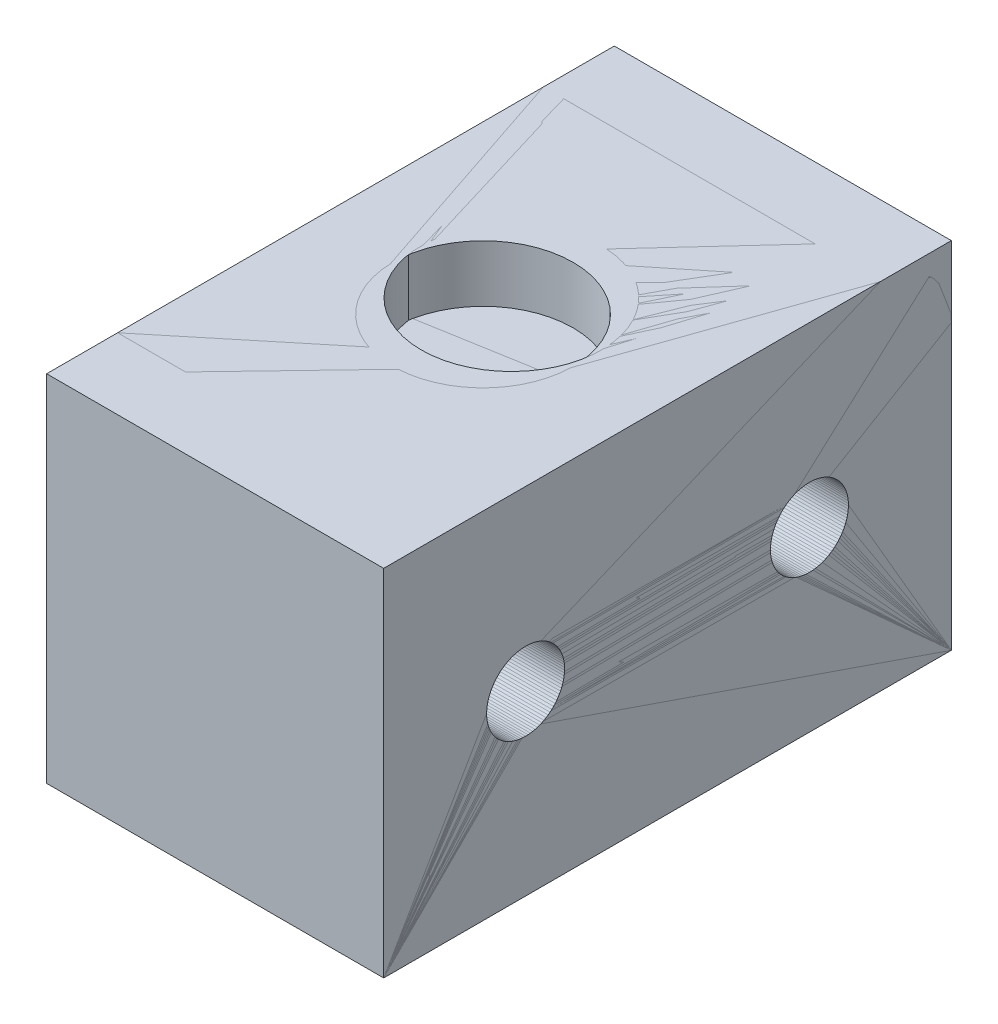
ISO-10303-21;
HEADER;
FILE_DESCRIPTION(('STEP AP214'),'2;1');
FILE_NAME('part.step','',(''),(''),'','','');
FILE_SCHEMA(('AUTOMOTIVE_DESIGN { 1 0 10303 214 1 1 1 1 }'));
ENDSEC;
DATA;
#1=APPLICATION_CONTEXT('core data for automotive mechanical design processes');
#2=APPLICATION_PROTOCOL_DEFINITION('international standard','automotive_design',2000,#1);
#3=PRODUCT_CONTEXT('',#1,'mechanical');
#4=PRODUCT('Part','Part','',(#3));
#5=PRODUCT_RELATED_PRODUCT_CATEGORY('part','',(#4));
#6=PRODUCT_DEFINITION_FORMATION('','',#4);
#7=PRODUCT_DEFINITION_CONTEXT('part definition',#1,'design');
#8=PRODUCT_DEFINITION('design','',#6,#7);
#9=PRODUCT_DEFINITION_SHAPE('','',#8);
#10=(LENGTH_UNIT() NAMED_UNIT(*) SI_UNIT(.MILLI.,.METRE.));
#11=(NAMED_UNIT(*) PLANE_ANGLE_UNIT() SI_UNIT($,.RADIAN.));
#12=(NAMED_UNIT(*) SI_UNIT($,.STERADIAN.) SOLID_ANGLE_UNIT());
#13=UNCERTAINTY_MEASURE_WITH_UNIT(LENGTH_MEASURE(1.E-05),#10,'distance_accuracy_value','');
#14=(GEOMETRIC_REPRESENTATION_CONTEXT(3) GLOBAL_UNCERTAINTY_ASSIGNED_CONTEXT((#13)) GLOBAL_UNIT_ASSIGNED_CONTEXT((#10,
#11,#12)) REPRESENTATION_CONTEXT('',''));
#15=CARTESIAN_POINT('',(0.,0.,0.));
#16=DIRECTION('',(0.,0.,1.));
#17=DIRECTION('',(1.,0.,0.));
#18=AXIS2_PLACEMENT_3D('',#15,#16,#17);
#19=CARTESIAN_POINT('',(-23.75,100.,0.));
#20=DIRECTION('',(-1.,0.,0.));
#21=DIRECTION('',(0.,0.,-1.));
#22=AXIS2_PLACEMENT_3D('',#19,#20,#21);
#23=PLANE('',#22);
#24=CARTESIAN_POINT('',(-23.7499999999999,87.5,-30.));
#25=DIRECTION('',(-1.,0.,0.));
#26=DIRECTION('',(0.,0.,1.));
#27=AXIS2_PLACEMENT_3D('',#24,#25,#26);
#28=CIRCLE('',#27,2.74999999999999);
#29=CARTESIAN_POINT('',(-23.7499999999999,87.5,-27.25));
#30=VERTEX_POINT('',#29);
#31=EDGE_CURVE('E182',#30,#30,#28,.T.);
#32=ORIENTED_EDGE('',*,*,#31,.F.);
#33=EDGE_LOOP('',(#32));
#34=FACE_BOUND('',#33,.T.);
#35=DIRECTION('',(0.,-1.,0.));
#36=VECTOR('',#35,1.);
#37=CARTESIAN_POINT('',(-23.75,100.,-40.));
#38=LINE('',#37,#36);
#39=CARTESIAN_POINT('',(-23.75,95.,-40.));
#40=VERTEX_POINT('',#39);
#41=CARTESIAN_POINT('',(-23.75,75.,-40.));
#42=VERTEX_POINT('',#41);
#43=EDGE_CURVE('E133',#40,#42,#38,.T.);
#44=ORIENTED_EDGE('',*,*,#43,.T.);
#45=DIRECTION('',(0.,0.,-1.));
#46=VECTOR('',#45,1.);
#47=CARTESIAN_POINT('',(-23.75,75.,0.));
#48=LINE('',#47,#46);
#49=CARTESIAN_POINT('',(-23.75,75.,0.));
#50=VERTEX_POINT('',#49);
#51=EDGE_CURVE('E113',#50,#42,#48,.T.);
#52=ORIENTED_EDGE('',*,*,#51,.F.);
#53=DIRECTION('',(0.,-1.,0.));
#54=VECTOR('',#53,1.);
#55=CARTESIAN_POINT('',(-23.75,100.,0.));
#56=LINE('',#55,#54);
#57=CARTESIAN_POINT('',(-23.75,100.,0.));
#58=VERTEX_POINT('',#57);
#59=EDGE_CURVE('E99',#58,#50,#56,.T.);
#60=ORIENTED_EDGE('',*,*,#59,.F.);
#61=DIRECTION('',(0.,0.,-1.));
#62=VECTOR('',#61,1.);
#63=CARTESIAN_POINT('',(-23.75,100.,0.));
#64=LINE('',#63,#62);
#65=CARTESIAN_POINT('',(-23.75,100.,-35.));
#66=VERTEX_POINT('',#65);
#67=EDGE_CURVE('E95',#58,#66,#64,.T.);
#68=ORIENTED_EDGE('',*,*,#67,.T.);
#69=CARTESIAN_POINT('',(-23.75,95.,-35.));
#70=DIRECTION('',(1.,0.,0.));
#71=DIRECTION('',(0.,0.,-1.));
#72=AXIS2_PLACEMENT_3D('',#69,#70,#71);
#73=CIRCLE('',#72,5.);
#74=EDGE_CURVE('E120',#40,#66,#73,.T.);
#75=ORIENTED_EDGE('',*,*,#74,.F.);
#76=EDGE_LOOP('',(#44,#52,#60,#68,#75));
#77=FACE_BOUND('',#76,.T.);
#78=CARTESIAN_POINT('',(-23.7499999999999,87.5,-10.));
#79=DIRECTION('',(-1.,0.,0.));
#80=DIRECTION('',(0.,0.,1.));
#81=AXIS2_PLACEMENT_3D('',#78,#79,#80);
#82=CIRCLE('',#81,2.74999999999999);
#83=CARTESIAN_POINT('',(-23.7499999999999,87.5,-7.25000000000001));
#84=VERTEX_POINT('',#83);
#85=EDGE_CURVE('E172',#84,#84,#82,.T.);
#86=ORIENTED_EDGE('',*,*,#85,.F.);
#87=EDGE_LOOP('',(#86));
#88=FACE_BOUND('',#87,.T.);
#89=ADVANCED_FACE('F47',(#34,#77,#88),#23,.T.);
#90=CARTESIAN_POINT('',(0.,100.,0.));
#91=DIRECTION('',(1.,0.,0.));
#92=DIRECTION('',(0.,1.,0.));
#93=AXIS2_PLACEMENT_3D('',#90,#91,#92);
#94=PLANE('',#93);
#95=CARTESIAN_POINT('',(0.,87.5,-30.));
#96=DIRECTION('',(-1.,0.,0.));
#97=DIRECTION('',(0.,0.,1.));
#98=AXIS2_PLACEMENT_3D('',#95,#96,#97);
#99=CIRCLE('',#98,2.74999999999999);
#100=CARTESIAN_POINT('',(0.,87.5,-27.25));
#101=VERTEX_POINT('',#100);
#102=EDGE_CURVE('E185',#101,#101,#99,.T.);
#103=ORIENTED_EDGE('',*,*,#102,.T.);
#104=EDGE_LOOP('',(#103));
#105=FACE_BOUND('',#104,.T.);
#106=CARTESIAN_POINT('',(0.,87.5,-10.));
#107=DIRECTION('',(-1.,0.,0.));
#108=DIRECTION('',(0.,0.,1.));
#109=AXIS2_PLACEMENT_3D('',#106,#107,#108);
#110=CIRCLE('',#109,2.74999999999999);
#111=CARTESIAN_POINT('',(0.,87.5,-7.25000000000001));
#112=VERTEX_POINT('',#111);
#113=EDGE_CURVE('E177',#112,#112,#110,.T.);
#114=ORIENTED_EDGE('',*,*,#113,.T.);
#115=EDGE_LOOP('',(#114));
#116=FACE_BOUND('',#115,.T.);
#117=DIRECTION('',(0.,0.,-1.));
#118=VECTOR('',#117,1.);
#119=CARTESIAN_POINT('',(0.,100.,0.));
#120=LINE('',#119,#118);
#121=CARTESIAN_POINT('',(0.,100.,0.));
#122=VERTEX_POINT('',#121);
#123=CARTESIAN_POINT('',(0.,100.,-35.));
#124=VERTEX_POINT('',#123);
#125=EDGE_CURVE('E93',#122,#124,#120,.T.);
#126=ORIENTED_EDGE('',*,*,#125,.F.);
#127=DIRECTION('',(0.,1.,0.));
#128=VECTOR('',#127,1.);
#129=CARTESIAN_POINT('',(0.,100.,0.));
#130=LINE('',#129,#128);
#131=CARTESIAN_POINT('',(0.,75.,0.));
#132=VERTEX_POINT('',#131);
#133=EDGE_CURVE('E100',#132,#122,#130,.T.);
#134=ORIENTED_EDGE('',*,*,#133,.F.);
#135=DIRECTION('',(0.,0.,-1.));
#136=VECTOR('',#135,1.);
#137=CARTESIAN_POINT('',(0.,75.,0.));
#138=LINE('',#137,#136);
#139=CARTESIAN_POINT('',(0.,75.,-40.));
#140=VERTEX_POINT('',#139);
#141=EDGE_CURVE('E121',#132,#140,#138,.T.);
#142=ORIENTED_EDGE('',*,*,#141,.T.);
#143=DIRECTION('',(0.,1.,0.));
#144=VECTOR('',#143,1.);
#145=CARTESIAN_POINT('',(0.,100.,-40.));
#146=LINE('',#145,#144);
#147=CARTESIAN_POINT('',(0.,95.,-40.));
#148=VERTEX_POINT('',#147);
#149=EDGE_CURVE('E131',#140,#148,#146,.T.);
#150=ORIENTED_EDGE('',*,*,#149,.T.);
#151=CARTESIAN_POINT('',(0.,95.,-35.));
#152=DIRECTION('',(-1.,0.,0.));
#153=DIRECTION('',(0.,1.,0.));
#154=AXIS2_PLACEMENT_3D('',#151,#152,#153);
#155=CIRCLE('',#154,5.);
#156=EDGE_CURVE('E12',#124,#148,#155,.T.);
#157=ORIENTED_EDGE('',*,*,#156,.F.);
#158=EDGE_LOOP('',(#126,#134,#142,#150,#157));
#159=FACE_BOUND('',#158,.T.);
#160=ADVANCED_FACE('F110',(#105,#116,#159),#94,.T.);
#161=CARTESIAN_POINT('',(0.,75.,0.));
#162=DIRECTION('',(0.,-1.,0.));
#163=DIRECTION('',(0.,0.,1.));
#164=AXIS2_PLACEMENT_3D('',#161,#162,#163);
#165=PLANE('',#164);
#166=DIRECTION('',(1.,0.,0.));
#167=VECTOR('',#166,1.);
#168=CARTESIAN_POINT('',(0.,75.,-40.));
#169=LINE('',#168,#167);
#170=EDGE_CURVE('E108',#42,#140,#169,.T.);
#171=ORIENTED_EDGE('',*,*,#170,.T.);
#172=ORIENTED_EDGE('',*,*,#141,.F.);
#173=DIRECTION('',(1.,0.,0.));
#174=VECTOR('',#173,1.);
#175=CARTESIAN_POINT('',(0.,75.,0.));
#176=LINE('',#175,#174);
#177=EDGE_CURVE('E104',#50,#132,#176,.T.);
#178=ORIENTED_EDGE('',*,*,#177,.F.);
#179=ORIENTED_EDGE('',*,*,#51,.T.);
#180=EDGE_LOOP('',(#171,#172,#178,#179));
#181=FACE_BOUND('',#180,.T.);
#182=ADVANCED_FACE('F138',(#181),#165,.T.);
#183=CARTESIAN_POINT('',(0.,100.,0.));
#184=DIRECTION('',(0.,1.,0.));
#185=DIRECTION('',(0.,0.,-1.));
#186=AXIS2_PLACEMENT_3D('',#183,#184,#185);
#187=PLANE('',#186);
#188=CARTESIAN_POINT('',(-12.,100.,-19.));
#189=DIRECTION('',(0.,-1.,0.));
#190=DIRECTION('',(0.,0.,-1.));
#191=AXIS2_PLACEMENT_3D('',#188,#189,#190);
#192=CIRCLE('',#191,6.35);
#193=CARTESIAN_POINT('',(-12.,100.,-25.35));
#194=VERTEX_POINT('',#193);
#195=EDGE_CURVE('E170',#194,#194,#192,.T.);
#196=ORIENTED_EDGE('',*,*,#195,.T.);
#197=EDGE_LOOP('',(#196));
#198=FACE_BOUND('',#197,.T.);
#199=ORIENTED_EDGE('',*,*,#67,.F.);
#200=DIRECTION('',(-1.,0.,0.));
#201=VECTOR('',#200,1.);
#202=CARTESIAN_POINT('',(0.,100.,0.));
#203=LINE('',#202,#201);
#204=EDGE_CURVE('E89',#122,#58,#203,.T.);
#205=ORIENTED_EDGE('',*,*,#204,.F.);
#206=ORIENTED_EDGE('',*,*,#125,.T.);
#207=DIRECTION('',(-1.,0.,0.));
#208=VECTOR('',#207,1.);
#209=CARTESIAN_POINT('',(0.,100.,-35.));
#210=LINE('',#209,#208);
#211=EDGE_CURVE('E55',#66,#124,#210,.F.);
#212=ORIENTED_EDGE('',*,*,#211,.F.);
#213=EDGE_LOOP('',(#199,#205,#206,#212));
#214=FACE_BOUND('',#213,.T.);
#215=ADVANCED_FACE('F91',(#198,#214),#187,.T.);
#216=CARTESIAN_POINT('',(0.,0.,0.));
#217=DIRECTION('',(0.,0.,1.));
#218=DIRECTION('',(-1.,0.,0.));
#219=AXIS2_PLACEMENT_3D('',#216,#217,#218);
#220=PLANE('',#219);
#221=ORIENTED_EDGE('',*,*,#133,.T.);
#222=ORIENTED_EDGE('',*,*,#204,.T.);
#223=ORIENTED_EDGE('',*,*,#59,.T.);
#224=ORIENTED_EDGE('',*,*,#177,.T.);
#225=EDGE_LOOP('',(#221,#222,#223,#224));
#226=FACE_BOUND('',#225,.T.);
#227=ADVANCED_FACE('F103',(#226),#220,.T.);
#228=CARTESIAN_POINT('',(0.,0.,-40.));
#229=DIRECTION('',(0.,0.,1.));
#230=DIRECTION('',(-1.,0.,0.));
#231=AXIS2_PLACEMENT_3D('',#228,#229,#230);
#232=PLANE('',#231);
#233=ORIENTED_EDGE('',*,*,#149,.F.);
#234=ORIENTED_EDGE('',*,*,#170,.F.);
#235=ORIENTED_EDGE('',*,*,#43,.F.);
#236=DIRECTION('',(-1.,0.,0.));
#237=VECTOR('',#236,1.);
#238=CARTESIAN_POINT('',(-23.75,95.,-40.));
#239=LINE('',#238,#237);
#240=EDGE_CURVE('E118',#148,#40,#239,.T.);
#241=ORIENTED_EDGE('',*,*,#240,.F.);
#242=EDGE_LOOP('',(#233,#234,#235,#241));
#243=FACE_BOUND('',#242,.T.);
#244=ADVANCED_FACE('F141',(#243),#232,.F.);
#245=CARTESIAN_POINT('',(-12.,96.,-19.));
#246=DIRECTION('',(0.,1.,0.));
#247=DIRECTION('',(0.,0.,-1.));
#248=AXIS2_PLACEMENT_3D('',#245,#246,#247);
#249=CYLINDRICAL_SURFACE('',#248,6.35);
#250=CARTESIAN_POINT('',(-12.,96.,-19.));
#251=DIRECTION('',(0.,-1.,0.));
#252=DIRECTION('',(0.,0.,-1.));
#253=AXIS2_PLACEMENT_3D('',#250,#251,#252);
#254=CIRCLE('',#253,6.35);
#255=CARTESIAN_POINT('',(-12.,96.,-25.35));
#256=VERTEX_POINT('',#255);
#257=EDGE_CURVE('E134',#256,#256,#254,.T.);
#258=ORIENTED_EDGE('',*,*,#257,.T.);
#259=EDGE_LOOP('',(#258));
#260=FACE_BOUND('',#259,.T.);
#261=ORIENTED_EDGE('',*,*,#195,.F.);
#262=EDGE_LOOP('',(#261));
#263=FACE_BOUND('',#262,.T.);
#264=ADVANCED_FACE('F143',(#260,#263),#249,.F.);
#265=CARTESIAN_POINT('',(-12.,96.,-19.));
#266=DIRECTION('',(0.,1.,0.));
#267=DIRECTION('',(0.,0.,-1.));
#268=AXIS2_PLACEMENT_3D('',#265,#266,#267);
#269=PLANE('',#268);
#270=ORIENTED_EDGE('',*,*,#257,.F.);
#271=EDGE_LOOP('',(#270));
#272=FACE_BOUND('',#271,.T.);
#273=ADVANCED_FACE('F149',(#272),#269,.T.);
#274=CARTESIAN_POINT('',(0.,87.5,-10.));
#275=DIRECTION('',(1.,0.,0.));
#276=DIRECTION('',(0.,0.,1.));
#277=AXIS2_PLACEMENT_3D('',#274,#275,#276);
#278=CYLINDRICAL_SURFACE('',#277,2.74999999999999);
#279=ORIENTED_EDGE('',*,*,#85,.T.);
#280=EDGE_LOOP('',(#279));
#281=FACE_BOUND('',#280,.T.);
#282=ORIENTED_EDGE('',*,*,#113,.F.);
#283=EDGE_LOOP('',(#282));
#284=FACE_BOUND('',#283,.T.);
#285=ADVANCED_FACE('F192',(#281,#284),#278,.F.);
#286=CARTESIAN_POINT('',(0.,87.5,-30.));
#287=DIRECTION('',(1.,0.,0.));
#288=DIRECTION('',(0.,0.,1.));
#289=AXIS2_PLACEMENT_3D('',#286,#287,#288);
#290=CYLINDRICAL_SURFACE('',#289,2.74999999999999);
#291=ORIENTED_EDGE('',*,*,#31,.T.);
#292=EDGE_LOOP('',(#291));
#293=FACE_BOUND('',#292,.T.);
#294=ORIENTED_EDGE('',*,*,#102,.F.);
#295=EDGE_LOOP('',(#294));
#296=FACE_BOUND('',#295,.T.);
#297=ADVANCED_FACE('F190',(#293,#296),#290,.F.);
#298=CARTESIAN_POINT('',(0.,95.,-35.));
#299=DIRECTION('',(1.,0.,0.));
#300=DIRECTION('',(0.,0.,1.));
#301=AXIS2_PLACEMENT_3D('',#298,#299,#300);
#302=CYLINDRICAL_SURFACE('',#301,5.);
#303=ORIENTED_EDGE('',*,*,#156,.T.);
#304=ORIENTED_EDGE('',*,*,#240,.T.);
#305=ORIENTED_EDGE('',*,*,#74,.T.);
#306=ORIENTED_EDGE('',*,*,#211,.T.);
#307=EDGE_LOOP('',(#303,#304,#305,#306));
#308=FACE_BOUND('',#307,.T.);
#309=ADVANCED_FACE('F49',(#308),#302,.T.);
#310=CLOSED_SHELL('',(#89,#160,#182,#215,#227,#244,#264,#273,#285,#297,#309));
#311=MANIFOLD_SOLID_BREP('B2_NOT_SHOWN',#310);
#312=CARTESIAN_POINT('',(-23.75,100.,-40.));
#313=DIRECTION('',(-1.,0.,0.));
#314=DIRECTION('',(0.,0.,1.));
#315=AXIS2_PLACEMENT_3D('',#312,#313,#314);
#316=PLANE('',#315);
#317=CARTESIAN_POINT('',(-23.7499999999999,87.5,-10.));
#318=DIRECTION('',(1.,0.,0.));
#319=DIRECTION('',(0.,0.,-1.));
#320=AXIS2_PLACEMENT_3D('',#317,#318,#319);
#321=CIRCLE('',#320,2.74999999999999);
#322=CARTESIAN_POINT('',(-23.7499999999999,87.5,-12.75));
#323=VERTEX_POINT('',#322);
#324=EDGE_CURVE('E403',#323,#323,#321,.T.);
#325=ORIENTED_EDGE('',*,*,#324,.T.);
#326=EDGE_LOOP('',(#325));
#327=FACE_BOUND('',#326,.T.);
#328=DIRECTION('',(0.,-1.,0.));
#329=VECTOR('',#328,1.);
#330=CARTESIAN_POINT('',(-23.75,100.,0.));
#331=LINE('',#330,#329);
#332=CARTESIAN_POINT('',(-23.75,95.,0.));
#333=VERTEX_POINT('',#332);
#334=CARTESIAN_POINT('',(-23.75,75.,0.));
#335=VERTEX_POINT('',#334);
#336=EDGE_CURVE('E338',#333,#335,#331,.T.);
#337=ORIENTED_EDGE('',*,*,#336,.F.);
#338=CARTESIAN_POINT('',(-23.75,95.,-5.));
#339=DIRECTION('',(-1.,0.,0.));
#340=DIRECTION('',(0.,0.,1.));
#341=AXIS2_PLACEMENT_3D('',#338,#339,#340);
#342=CIRCLE('',#341,5.);
#343=CARTESIAN_POINT('',(-23.75,100.,-5.));
#344=VERTEX_POINT('',#343);
#345=EDGE_CURVE('E291',#333,#344,#342,.T.);
#346=ORIENTED_EDGE('',*,*,#345,.T.);
#347=DIRECTION('',(0.,0.,1.));
#348=VECTOR('',#347,1.);
#349=CARTESIAN_POINT('',(-23.75,100.,-40.));
#350=LINE('',#349,#348);
#351=CARTESIAN_POINT('',(-23.75,100.,-40.));
#352=VERTEX_POINT('',#351);
#353=EDGE_CURVE('E319',#352,#344,#350,.T.);
#354=ORIENTED_EDGE('',*,*,#353,.F.);
#355=DIRECTION('',(0.,-1.,0.));
#356=VECTOR('',#355,1.);
#357=CARTESIAN_POINT('',(-23.75,100.,-40.));
#358=LINE('',#357,#356);
#359=CARTESIAN_POINT('',(-23.75,75.,-40.));
#360=VERTEX_POINT('',#359);
#361=EDGE_CURVE('E330',#352,#360,#358,.T.);
#362=ORIENTED_EDGE('',*,*,#361,.T.);
#363=DIRECTION('',(0.,0.,1.));
#364=VECTOR('',#363,1.);
#365=CARTESIAN_POINT('',(-23.75,75.,-40.));
#366=LINE('',#365,#364);
#367=EDGE_CURVE('E353',#360,#335,#366,.T.);
#368=ORIENTED_EDGE('',*,*,#367,.T.);
#369=EDGE_LOOP('',(#337,#346,#354,#362,#368));
#370=FACE_BOUND('',#369,.T.);
#371=CARTESIAN_POINT('',(-23.7499999999999,87.5,-30.));
#372=DIRECTION('',(1.,0.,0.));
#373=DIRECTION('',(0.,0.,-1.));
#374=AXIS2_PLACEMENT_3D('',#371,#372,#373);
#375=CIRCLE('',#374,2.74999999999999);
#376=CARTESIAN_POINT('',(-23.7499999999999,87.5,-32.75));
#377=VERTEX_POINT('',#376);
#378=EDGE_CURVE('E396',#377,#377,#375,.T.);
#379=ORIENTED_EDGE('',*,*,#378,.T.);
#380=EDGE_LOOP('',(#379));
#381=FACE_BOUND('',#380,.T.);
#382=ADVANCED_FACE('F269',(#327,#370,#381),#316,.T.);
#383=CARTESIAN_POINT('',(0.,100.,-40.));
#384=DIRECTION('',(1.,0.,0.));
#385=DIRECTION('',(0.,1.,0.));
#386=AXIS2_PLACEMENT_3D('',#383,#384,#385);
#387=PLANE('',#386);
#388=CARTESIAN_POINT('',(0.,87.5,-10.));
#389=DIRECTION('',(1.,0.,0.));
#390=DIRECTION('',(0.,0.,-1.));
#391=AXIS2_PLACEMENT_3D('',#388,#389,#390);
#392=CIRCLE('',#391,2.74999999999999);
#393=CARTESIAN_POINT('',(0.,87.5,-12.75));
#394=VERTEX_POINT('',#393);
#395=EDGE_CURVE('E407',#394,#394,#392,.T.);
#396=ORIENTED_EDGE('',*,*,#395,.F.);
#397=EDGE_LOOP('',(#396));
#398=FACE_BOUND('',#397,.T.);
#399=CARTESIAN_POINT('',(0.,87.5,-30.));
#400=DIRECTION('',(1.,0.,0.));
#401=DIRECTION('',(0.,0.,-1.));
#402=AXIS2_PLACEMENT_3D('',#399,#400,#401);
#403=CIRCLE('',#402,2.74999999999999);
#404=CARTESIAN_POINT('',(0.,87.5,-32.75));
#405=VERTEX_POINT('',#404);
#406=EDGE_CURVE('E399',#405,#405,#403,.T.);
#407=ORIENTED_EDGE('',*,*,#406,.F.);
#408=EDGE_LOOP('',(#407));
#409=FACE_BOUND('',#408,.T.);
#410=DIRECTION('',(0.,0.,1.));
#411=VECTOR('',#410,1.);
#412=CARTESIAN_POINT('',(0.,100.,-40.));
#413=LINE('',#412,#411);
#414=CARTESIAN_POINT('',(0.,100.,-40.));
#415=VERTEX_POINT('',#414);
#416=CARTESIAN_POINT('',(0.,100.,-5.));
#417=VERTEX_POINT('',#416);
#418=EDGE_CURVE('E312',#415,#417,#413,.T.);
#419=ORIENTED_EDGE('',*,*,#418,.T.);
#420=CARTESIAN_POINT('',(0.,95.,-5.));
#421=DIRECTION('',(1.,0.,0.));
#422=DIRECTION('',(0.,1.,0.));
#423=AXIS2_PLACEMENT_3D('',#420,#421,#422);
#424=CIRCLE('',#423,5.);
#425=CARTESIAN_POINT('',(0.,95.,0.));
#426=VERTEX_POINT('',#425);
#427=EDGE_CURVE('E45',#417,#426,#424,.T.);
#428=ORIENTED_EDGE('',*,*,#427,.T.);
#429=DIRECTION('',(0.,1.,0.));
#430=VECTOR('',#429,1.);
#431=CARTESIAN_POINT('',(0.,100.,0.));
#432=LINE('',#431,#430);
#433=CARTESIAN_POINT('',(0.,75.,0.));
#434=VERTEX_POINT('',#433);
#435=EDGE_CURVE('E346',#434,#426,#432,.T.);
#436=ORIENTED_EDGE('',*,*,#435,.F.);
#437=DIRECTION('',(0.,0.,1.));
#438=VECTOR('',#437,1.);
#439=CARTESIAN_POINT('',(0.,75.,-40.));
#440=LINE('',#439,#438);
#441=CARTESIAN_POINT('',(0.,75.,-40.));
#442=VERTEX_POINT('',#441);
#443=EDGE_CURVE('E334',#442,#434,#440,.T.);
#444=ORIENTED_EDGE('',*,*,#443,.F.);
#445=DIRECTION('',(0.,1.,0.));
#446=VECTOR('',#445,1.);
#447=CARTESIAN_POINT('',(0.,100.,-40.));
#448=LINE('',#447,#446);
#449=EDGE_CURVE('E327',#442,#415,#448,.T.);
#450=ORIENTED_EDGE('',*,*,#449,.T.);
#451=EDGE_LOOP('',(#419,#428,#436,#444,#450));
#452=FACE_BOUND('',#451,.T.);
#453=ADVANCED_FACE('F332',(#398,#409,#452),#387,.T.);
#454=CARTESIAN_POINT('',(0.,75.,-40.));
#455=DIRECTION('',(0.,-1.,0.));
#456=DIRECTION('',(0.,0.,-1.));
#457=AXIS2_PLACEMENT_3D('',#454,#455,#456);
#458=PLANE('',#457);
#459=DIRECTION('',(1.,0.,0.));
#460=VECTOR('',#459,1.);
#461=CARTESIAN_POINT('',(0.,75.,0.));
#462=LINE('',#461,#460);
#463=EDGE_CURVE('E335',#335,#434,#462,.T.);
#464=ORIENTED_EDGE('',*,*,#463,.F.);
#465=ORIENTED_EDGE('',*,*,#367,.F.);
#466=DIRECTION('',(1.,0.,0.));
#467=VECTOR('',#466,1.);
#468=CARTESIAN_POINT('',(0.,75.,-40.));
#469=LINE('',#468,#467);
#470=EDGE_CURVE('E320',#360,#442,#469,.T.);
#471=ORIENTED_EDGE('',*,*,#470,.T.);
#472=ORIENTED_EDGE('',*,*,#443,.T.);
#473=EDGE_LOOP('',(#464,#465,#471,#472));
#474=FACE_BOUND('',#473,.T.);
#475=ADVANCED_FACE('F366',(#474),#458,.T.);
#476=CARTESIAN_POINT('',(0.,100.,-40.));
#477=DIRECTION('',(0.,1.,0.));
#478=DIRECTION('',(0.,0.,1.));
#479=AXIS2_PLACEMENT_3D('',#476,#477,#478);
#480=PLANE('',#479);
#481=CARTESIAN_POINT('',(-12.,100.,-21.));
#482=DIRECTION('',(0.,1.,0.));
#483=DIRECTION('',(0.,0.,1.));
#484=AXIS2_PLACEMENT_3D('',#481,#482,#483);
#485=CIRCLE('',#484,6.35);
#486=CARTESIAN_POINT('',(-12.,100.,-14.65));
#487=VERTEX_POINT('',#486);
#488=EDGE_CURVE('E341',#487,#487,#485,.T.);
#489=ORIENTED_EDGE('',*,*,#488,.F.);
#490=EDGE_LOOP('',(#489));
#491=FACE_BOUND('',#490,.T.);
#492=ORIENTED_EDGE('',*,*,#353,.T.);
#493=DIRECTION('',(-1.,0.,0.));
#494=VECTOR('',#493,1.);
#495=CARTESIAN_POINT('',(0.,100.,-5.));
#496=LINE('',#495,#494);
#497=EDGE_CURVE('E277',#344,#417,#496,.F.);
#498=ORIENTED_EDGE('',*,*,#497,.T.);
#499=ORIENTED_EDGE('',*,*,#418,.F.);
#500=DIRECTION('',(-1.,0.,0.));
#501=VECTOR('',#500,1.);
#502=CARTESIAN_POINT('',(0.,100.,-40.));
#503=LINE('',#502,#501);
#504=EDGE_CURVE('E315',#415,#352,#503,.T.);
#505=ORIENTED_EDGE('',*,*,#504,.T.);
#506=EDGE_LOOP('',(#492,#498,#499,#505));
#507=FACE_BOUND('',#506,.T.);
#508=ADVANCED_FACE('F314',(#491,#507),#480,.T.);
#509=CARTESIAN_POINT('',(0.,0.,-40.));
#510=DIRECTION('',(0.,0.,-1.));
#511=DIRECTION('',(-1.,0.,0.));
#512=AXIS2_PLACEMENT_3D('',#509,#510,#511);
#513=PLANE('',#512);
#514=ORIENTED_EDGE('',*,*,#449,.F.);
#515=ORIENTED_EDGE('',*,*,#470,.F.);
#516=ORIENTED_EDGE('',*,*,#361,.F.);
#517=ORIENTED_EDGE('',*,*,#504,.F.);
#518=EDGE_LOOP('',(#514,#515,#516,#517));
#519=FACE_BOUND('',#518,.T.);
#520=ADVANCED_FACE('F325',(#519),#513,.T.);
#521=CARTESIAN_POINT('',(0.,0.,0.));
#522=DIRECTION('',(0.,0.,-1.));
#523=DIRECTION('',(-1.,0.,0.));
#524=AXIS2_PLACEMENT_3D('',#521,#522,#523);
#525=PLANE('',#524);
#526=ORIENTED_EDGE('',*,*,#435,.T.);
#527=DIRECTION('',(-1.,0.,0.));
#528=VECTOR('',#527,1.);
#529=CARTESIAN_POINT('',(-23.75,95.,0.));
#530=LINE('',#529,#528);
#531=EDGE_CURVE('E352',#426,#333,#530,.T.);
#532=ORIENTED_EDGE('',*,*,#531,.T.);
#533=ORIENTED_EDGE('',*,*,#336,.T.);
#534=ORIENTED_EDGE('',*,*,#463,.T.);
#535=EDGE_LOOP('',(#526,#532,#533,#534));
#536=FACE_BOUND('',#535,.T.);
#537=ADVANCED_FACE('F361',(#536),#525,.F.);
#538=CARTESIAN_POINT('',(-12.,96.,-21.));
#539=DIRECTION('',(0.,1.,0.));
#540=DIRECTION('',(0.,0.,1.));
#541=AXIS2_PLACEMENT_3D('',#538,#539,#540);
#542=CYLINDRICAL_SURFACE('',#541,6.35);
#543=CARTESIAN_POINT('',(-12.,96.,-21.));
#544=DIRECTION('',(0.,1.,0.));
#545=DIRECTION('',(0.,0.,1.));
#546=AXIS2_PLACEMENT_3D('',#543,#544,#545);
#547=CIRCLE('',#546,6.35);
#548=CARTESIAN_POINT('',(-12.,96.,-14.65));
#549=VERTEX_POINT('',#548);
#550=EDGE_CURVE('E349',#549,#549,#547,.T.);
#551=ORIENTED_EDGE('',*,*,#550,.F.);
#552=EDGE_LOOP('',(#551));
#553=FACE_BOUND('',#552,.T.);
#554=ORIENTED_EDGE('',*,*,#488,.T.);
#555=EDGE_LOOP('',(#554));
#556=FACE_BOUND('',#555,.T.);
#557=ADVANCED_FACE('F421',(#553,#556),#542,.F.);
#558=CARTESIAN_POINT('',(-12.,96.,-21.));
#559=DIRECTION('',(0.,1.,0.));
#560=DIRECTION('',(0.,0.,1.));
#561=AXIS2_PLACEMENT_3D('',#558,#559,#560);
#562=PLANE('',#561);
#563=ORIENTED_EDGE('',*,*,#550,.T.);
#564=EDGE_LOOP('',(#563));
#565=FACE_BOUND('',#564,.T.);
#566=ADVANCED_FACE('F415',(#565),#562,.T.);
#567=CARTESIAN_POINT('',(0.,87.5,-30.));
#568=DIRECTION('',(1.,0.,0.));
#569=DIRECTION('',(0.,0.,-1.));
#570=AXIS2_PLACEMENT_3D('',#567,#568,#569);
#571=CYLINDRICAL_SURFACE('',#570,2.74999999999999);
#572=ORIENTED_EDGE('',*,*,#378,.F.);
#573=EDGE_LOOP('',(#572));
#574=FACE_BOUND('',#573,.T.);
#575=ORIENTED_EDGE('',*,*,#406,.T.);
#576=EDGE_LOOP('',(#575));
#577=FACE_BOUND('',#576,.T.);
#578=ADVANCED_FACE('F372',(#574,#577),#571,.F.);
#579=CARTESIAN_POINT('',(0.,87.5,-10.));
#580=DIRECTION('',(1.,0.,0.));
#581=DIRECTION('',(0.,0.,-1.));
#582=AXIS2_PLACEMENT_3D('',#579,#580,#581);
#583=CYLINDRICAL_SURFACE('',#582,2.74999999999999);
#584=ORIENTED_EDGE('',*,*,#324,.F.);
#585=EDGE_LOOP('',(#584));
#586=FACE_BOUND('',#585,.T.);
#587=ORIENTED_EDGE('',*,*,#395,.T.);
#588=EDGE_LOOP('',(#587));
#589=FACE_BOUND('',#588,.T.);
#590=ADVANCED_FACE('F368',(#586,#589),#583,.F.);
#591=CARTESIAN_POINT('',(0.,95.,-5.));
#592=DIRECTION('',(1.,0.,0.));
#593=DIRECTION('',(0.,0.,-1.));
#594=AXIS2_PLACEMENT_3D('',#591,#592,#593);
#595=CYLINDRICAL_SURFACE('',#594,5.);
#596=ORIENTED_EDGE('',*,*,#427,.F.);
#597=ORIENTED_EDGE('',*,*,#497,.F.);
#598=ORIENTED_EDGE('',*,*,#345,.F.);
#599=ORIENTED_EDGE('',*,*,#531,.F.);
#600=EDGE_LOOP('',(#596,#597,#598,#599));
#601=FACE_BOUND('',#600,.T.);
#602=ADVANCED_FACE('F271',(#601),#595,.T.);
#603=CLOSED_SHELL('',(#382,#453,#475,#508,#520,#537,#557,#566,#578,#590,#602));
#604=MANIFOLD_SOLID_BREP('B6',#603);
#605=ADVANCED_BREP_SHAPE_REPRESENTATION('',(#18,#311,#604),#14);
#606=SHAPE_DEFINITION_REPRESENTATION(#9,#605);
ENDSEC;
END-ISO-10303-21;
